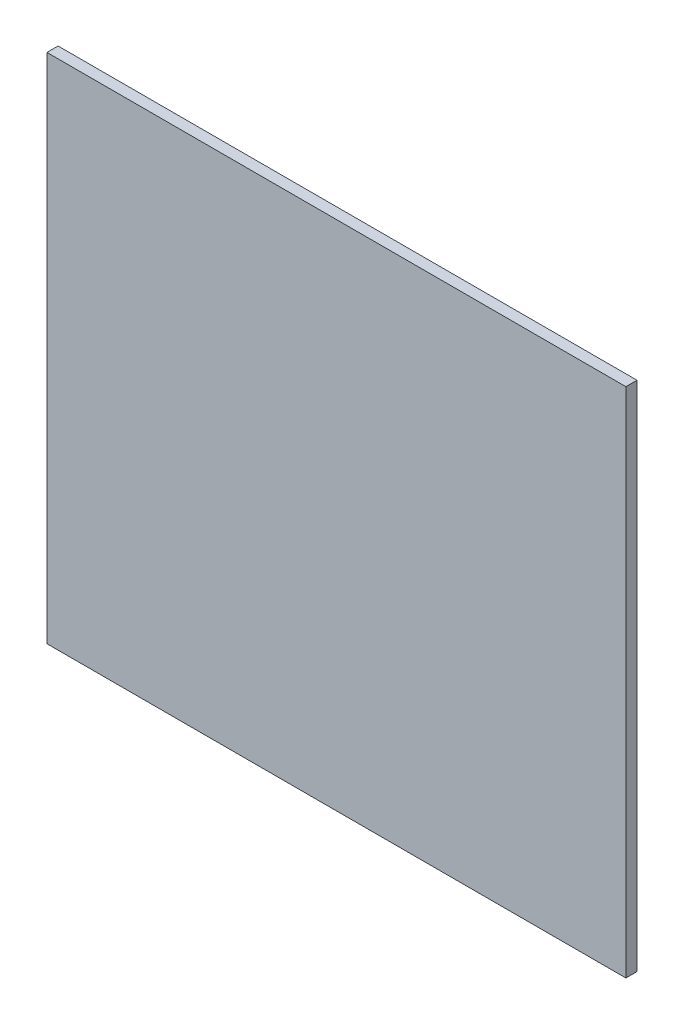
ISO-10303-21;
HEADER;
FILE_DESCRIPTION(('STEP AP214'),'2;1');
FILE_NAME('part.step','',(''),(''),'','','');
FILE_SCHEMA(('AUTOMOTIVE_DESIGN { 1 0 10303 214 1 1 1 1 }'));
ENDSEC;
DATA;
#1=APPLICATION_CONTEXT('core data for automotive mechanical design processes');
#2=APPLICATION_PROTOCOL_DEFINITION('international standard','automotive_design',2000,#1);
#3=PRODUCT_CONTEXT('',#1,'mechanical');
#4=PRODUCT('Part','Part','',(#3));
#5=PRODUCT_RELATED_PRODUCT_CATEGORY('part','',(#4));
#6=PRODUCT_DEFINITION_FORMATION('','',#4);
#7=PRODUCT_DEFINITION_CONTEXT('part definition',#1,'design');
#8=PRODUCT_DEFINITION('design','',#6,#7);
#9=PRODUCT_DEFINITION_SHAPE('','',#8);
#10=(LENGTH_UNIT() NAMED_UNIT(*) SI_UNIT(.MILLI.,.METRE.));
#11=(NAMED_UNIT(*) PLANE_ANGLE_UNIT() SI_UNIT($,.RADIAN.));
#12=(NAMED_UNIT(*) SI_UNIT($,.STERADIAN.) SOLID_ANGLE_UNIT());
#13=UNCERTAINTY_MEASURE_WITH_UNIT(LENGTH_MEASURE(1.E-05),#10,'distance_accuracy_value','');
#14=(GEOMETRIC_REPRESENTATION_CONTEXT(3) GLOBAL_UNCERTAINTY_ASSIGNED_CONTEXT((#13)) GLOBAL_UNIT_ASSIGNED_CONTEXT((#10,
#11,#12)) REPRESENTATION_CONTEXT('',''));
#15=CARTESIAN_POINT('',(0.,0.,0.));
#16=DIRECTION('',(0.,0.,1.));
#17=DIRECTION('',(1.,0.,0.));
#18=AXIS2_PLACEMENT_3D('',#15,#16,#17);
#19=CARTESIAN_POINT('',(-130.,-115.,5.));
#20=DIRECTION('',(1.,0.,0.));
#21=DIRECTION('',(0.,0.,-1.));
#22=AXIS2_PLACEMENT_3D('',#19,#20,#21);
#23=PLANE('',#22);
#24=DIRECTION('',(0.,-1.,0.));
#25=VECTOR('',#24,1.);
#26=CARTESIAN_POINT('',(-130.,-115.,0.));
#27=LINE('',#26,#25);
#28=CARTESIAN_POINT('',(-130.,115.,0.));
#29=VERTEX_POINT('',#28);
#30=CARTESIAN_POINT('',(-130.,-115.,0.));
#31=VERTEX_POINT('',#30);
#32=EDGE_CURVE('E98',#29,#31,#27,.T.);
#33=ORIENTED_EDGE('',*,*,#32,.T.);
#34=DIRECTION('',(0.,0.,-1.));
#35=VECTOR('',#34,1.);
#36=CARTESIAN_POINT('',(-130.,-115.,5.));
#37=LINE('',#36,#35);
#38=CARTESIAN_POINT('',(-130.,-115.,5.));
#39=VERTEX_POINT('',#38);
#40=EDGE_CURVE('E11',#39,#31,#37,.T.);
#41=ORIENTED_EDGE('',*,*,#40,.F.);
#42=DIRECTION('',(0.,-1.,0.));
#43=VECTOR('',#42,1.);
#44=CARTESIAN_POINT('',(-130.,-115.,5.));
#45=LINE('',#44,#43);
#46=CARTESIAN_POINT('',(-130.,115.,5.));
#47=VERTEX_POINT('',#46);
#48=EDGE_CURVE('E86',#47,#39,#45,.T.);
#49=ORIENTED_EDGE('',*,*,#48,.F.);
#50=DIRECTION('',(0.,0.,-1.));
#51=VECTOR('',#50,1.);
#52=CARTESIAN_POINT('',(-130.,115.,5.));
#53=LINE('',#52,#51);
#54=EDGE_CURVE('E94',#47,#29,#53,.T.);
#55=ORIENTED_EDGE('',*,*,#54,.T.);
#56=EDGE_LOOP('',(#33,#41,#49,#55));
#57=FACE_BOUND('',#56,.T.);
#58=ADVANCED_FACE('F35',(#57),#23,.F.);
#59=CARTESIAN_POINT('',(130.,-115.,5.));
#60=DIRECTION('',(0.,1.,0.));
#61=DIRECTION('',(-1.,0.,0.));
#62=AXIS2_PLACEMENT_3D('',#59,#60,#61);
#63=PLANE('',#62);
#64=DIRECTION('',(1.,0.,0.));
#65=VECTOR('',#64,1.);
#66=CARTESIAN_POINT('',(130.,-115.,0.));
#67=LINE('',#66,#65);
#68=CARTESIAN_POINT('',(130.,-115.,0.));
#69=VERTEX_POINT('',#68);
#70=EDGE_CURVE('E90',#31,#69,#67,.T.);
#71=ORIENTED_EDGE('',*,*,#70,.T.);
#72=DIRECTION('',(0.,0.,-1.));
#73=VECTOR('',#72,1.);
#74=CARTESIAN_POINT('',(130.,-115.,5.));
#75=LINE('',#74,#73);
#76=CARTESIAN_POINT('',(130.,-115.,5.));
#77=VERTEX_POINT('',#76);
#78=EDGE_CURVE('E43',#77,#69,#75,.T.);
#79=ORIENTED_EDGE('',*,*,#78,.F.);
#80=DIRECTION('',(1.,0.,0.));
#81=VECTOR('',#80,1.);
#82=CARTESIAN_POINT('',(130.,-115.,5.));
#83=LINE('',#82,#81);
#84=EDGE_CURVE('E81',#39,#77,#83,.T.);
#85=ORIENTED_EDGE('',*,*,#84,.F.);
#86=ORIENTED_EDGE('',*,*,#40,.T.);
#87=EDGE_LOOP('',(#71,#79,#85,#86));
#88=FACE_BOUND('',#87,.T.);
#89=ADVANCED_FACE('F89',(#88),#63,.F.);
#90=CARTESIAN_POINT('',(130.,-115.,5.));
#91=DIRECTION('',(-1.,0.,0.));
#92=DIRECTION('',(0.,0.,1.));
#93=AXIS2_PLACEMENT_3D('',#90,#91,#92);
#94=PLANE('',#93);
#95=DIRECTION('',(0.,1.,0.));
#96=VECTOR('',#95,1.);
#97=CARTESIAN_POINT('',(130.,-115.,0.));
#98=LINE('',#97,#96);
#99=CARTESIAN_POINT('',(130.,115.,0.));
#100=VERTEX_POINT('',#99);
#101=EDGE_CURVE('E68',#69,#100,#98,.T.);
#102=ORIENTED_EDGE('',*,*,#101,.T.);
#103=DIRECTION('',(0.,0.,-1.));
#104=VECTOR('',#103,1.);
#105=CARTESIAN_POINT('',(130.,115.,5.));
#106=LINE('',#105,#104);
#107=CARTESIAN_POINT('',(130.,115.,5.));
#108=VERTEX_POINT('',#107);
#109=EDGE_CURVE('E91',#108,#100,#106,.T.);
#110=ORIENTED_EDGE('',*,*,#109,.F.);
#111=DIRECTION('',(0.,1.,0.));
#112=VECTOR('',#111,1.);
#113=CARTESIAN_POINT('',(130.,-115.,5.));
#114=LINE('',#113,#112);
#115=EDGE_CURVE('E84',#77,#108,#114,.T.);
#116=ORIENTED_EDGE('',*,*,#115,.F.);
#117=ORIENTED_EDGE('',*,*,#78,.T.);
#118=EDGE_LOOP('',(#102,#110,#116,#117));
#119=FACE_BOUND('',#118,.T.);
#120=ADVANCED_FACE('F92',(#119),#94,.F.);
#121=CARTESIAN_POINT('',(130.,115.,5.));
#122=DIRECTION('',(0.,-1.,0.));
#123=DIRECTION('',(1.,0.,0.));
#124=AXIS2_PLACEMENT_3D('',#121,#122,#123);
#125=PLANE('',#124);
#126=DIRECTION('',(-1.,0.,0.));
#127=VECTOR('',#126,1.);
#128=CARTESIAN_POINT('',(130.,115.,0.));
#129=LINE('',#128,#127);
#130=EDGE_CURVE('E74',#100,#29,#129,.T.);
#131=ORIENTED_EDGE('',*,*,#130,.T.);
#132=ORIENTED_EDGE('',*,*,#54,.F.);
#133=DIRECTION('',(-1.,0.,0.));
#134=VECTOR('',#133,1.);
#135=CARTESIAN_POINT('',(130.,115.,5.));
#136=LINE('',#135,#134);
#137=EDGE_CURVE('E51',#108,#47,#136,.T.);
#138=ORIENTED_EDGE('',*,*,#137,.F.);
#139=ORIENTED_EDGE('',*,*,#109,.T.);
#140=EDGE_LOOP('',(#131,#132,#138,#139));
#141=FACE_BOUND('',#140,.T.);
#142=ADVANCED_FACE('F105',(#141),#125,.F.);
#143=CARTESIAN_POINT('',(0.,0.,5.));
#144=DIRECTION('',(0.,0.,1.));
#145=DIRECTION('',(1.,0.,0.));
#146=AXIS2_PLACEMENT_3D('',#143,#144,#145);
#147=PLANE('',#146);
#148=ORIENTED_EDGE('',*,*,#48,.T.);
#149=ORIENTED_EDGE('',*,*,#84,.T.);
#150=ORIENTED_EDGE('',*,*,#115,.T.);
#151=ORIENTED_EDGE('',*,*,#137,.T.);
#152=EDGE_LOOP('',(#148,#149,#150,#151));
#153=FACE_BOUND('',#152,.T.);
#154=ADVANCED_FACE('F82',(#153),#147,.T.);
#155=CARTESIAN_POINT('',(0.,0.,0.));
#156=DIRECTION('',(0.,0.,1.));
#157=DIRECTION('',(1.,0.,0.));
#158=AXIS2_PLACEMENT_3D('',#155,#156,#157);
#159=PLANE('',#158);
#160=ORIENTED_EDGE('',*,*,#32,.F.);
#161=ORIENTED_EDGE('',*,*,#130,.F.);
#162=ORIENTED_EDGE('',*,*,#101,.F.);
#163=ORIENTED_EDGE('',*,*,#70,.F.);
#164=EDGE_LOOP('',(#160,#161,#162,#163));
#165=FACE_BOUND('',#164,.T.);
#166=ADVANCED_FACE('F108',(#165),#159,.F.);
#167=CLOSED_SHELL('',(#58,#89,#120,#142,#154,#166));
#168=MANIFOLD_SOLID_BREP('B2',#167);
#169=ADVANCED_BREP_SHAPE_REPRESENTATION('',(#18,#168),#14);
#170=SHAPE_DEFINITION_REPRESENTATION(#9,#169);
ENDSEC;
END-ISO-10303-21;
